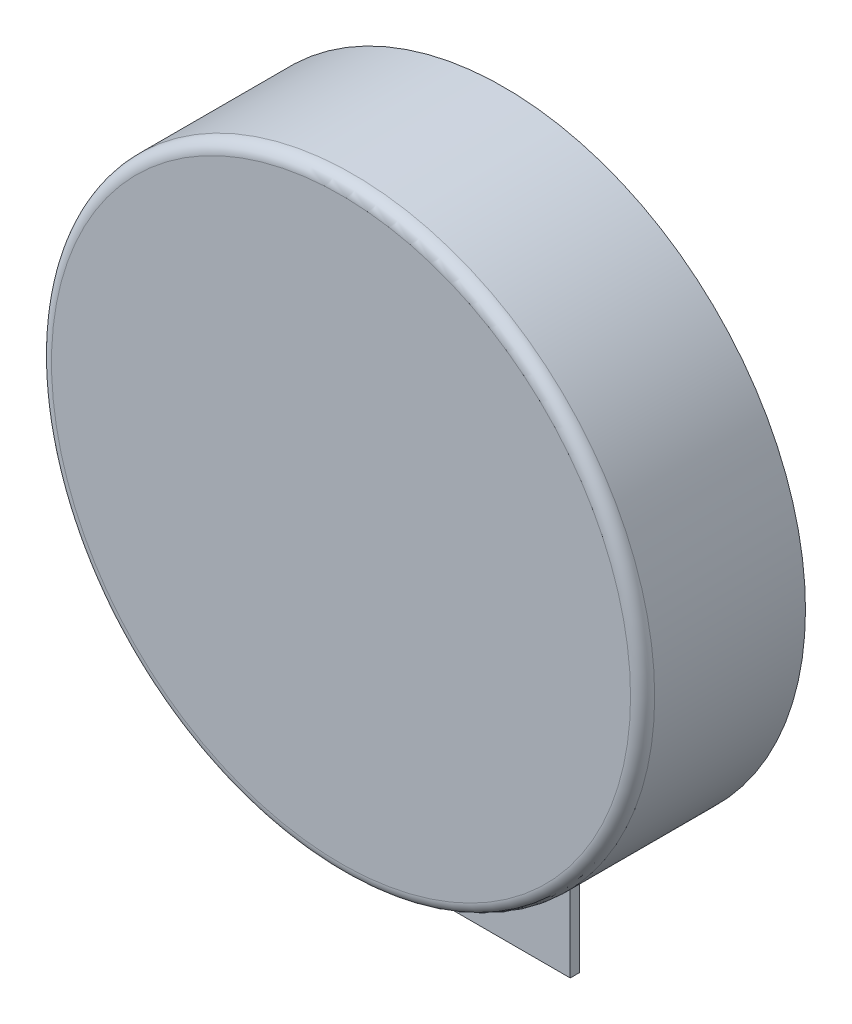
ISO-10303-21;
HEADER;
FILE_DESCRIPTION(('STEP AP214'),'2;1');
FILE_NAME('part.step','',(''),(''),'','','');
FILE_SCHEMA(('AUTOMOTIVE_DESIGN { 1 0 10303 214 1 1 1 1 }'));
ENDSEC;
DATA;
#1=APPLICATION_CONTEXT('core data for automotive mechanical design processes');
#2=APPLICATION_PROTOCOL_DEFINITION('international standard','automotive_design',2000,#1);
#3=PRODUCT_CONTEXT('',#1,'mechanical');
#4=PRODUCT('Part','Part','',(#3));
#5=PRODUCT_RELATED_PRODUCT_CATEGORY('part','',(#4));
#6=PRODUCT_DEFINITION_FORMATION('','',#4);
#7=PRODUCT_DEFINITION_CONTEXT('part definition',#1,'design');
#8=PRODUCT_DEFINITION('design','',#6,#7);
#9=PRODUCT_DEFINITION_SHAPE('','',#8);
#10=(LENGTH_UNIT() NAMED_UNIT(*) SI_UNIT(.MILLI.,.METRE.));
#11=(NAMED_UNIT(*) PLANE_ANGLE_UNIT() SI_UNIT($,.RADIAN.));
#12=(NAMED_UNIT(*) SI_UNIT($,.STERADIAN.) SOLID_ANGLE_UNIT());
#13=UNCERTAINTY_MEASURE_WITH_UNIT(LENGTH_MEASURE(1.E-05),#10,'distance_accuracy_value','');
#14=(GEOMETRIC_REPRESENTATION_CONTEXT(3) GLOBAL_UNCERTAINTY_ASSIGNED_CONTEXT((#13)) GLOBAL_UNIT_ASSIGNED_CONTEXT((#10,
#11,#12)) REPRESENTATION_CONTEXT('',''));
#15=CARTESIAN_POINT('',(0.,0.,0.));
#16=DIRECTION('',(0.,0.,1.));
#17=DIRECTION('',(1.,0.,0.));
#18=AXIS2_PLACEMENT_3D('',#15,#16,#17);
#19=CARTESIAN_POINT('',(0.,0.,2.7));
#20=DIRECTION('',(0.,0.,-1.));
#21=DIRECTION('',(-1.,0.,0.));
#22=AXIS2_PLACEMENT_3D('',#19,#20,#21);
#23=CYLINDRICAL_SURFACE('',#22,5.);
#24=CARTESIAN_POINT('',(0.,0.,2.5));
#25=DIRECTION('',(0.,0.,1.));
#26=DIRECTION('',(1.,0.,0.));
#27=AXIS2_PLACEMENT_3D('',#24,#25,#26);
#28=CIRCLE('',#27,5.);
#29=CARTESIAN_POINT('',(5.,0.,2.5));
#30=VERTEX_POINT('',#29);
#31=EDGE_CURVE('E11',#30,#30,#28,.F.);
#32=ORIENTED_EDGE('',*,*,#31,.T.);
#33=EDGE_LOOP('',(#32));
#34=FACE_BOUND('',#33,.T.);
#35=CARTESIAN_POINT('',(0.,0.,0.));
#36=DIRECTION('',(0.,0.,1.));
#37=DIRECTION('',(1.,0.,0.));
#38=AXIS2_PLACEMENT_3D('',#35,#36,#37);
#39=CIRCLE('',#38,5.);
#40=CARTESIAN_POINT('',(1.25,-4.84122918275927,0.));
#41=VERTEX_POINT('',#40);
#42=CARTESIAN_POINT('',(-1.25,-4.84122918275927,0.));
#43=VERTEX_POINT('',#42);
#44=EDGE_CURVE('E118',#41,#43,#39,.T.);
#45=ORIENTED_EDGE('',*,*,#44,.T.);
#46=DIRECTION('',(0.,0.,-1.));
#47=VECTOR('',#46,1.);
#48=CARTESIAN_POINT('',(-1.25,-4.84122918275927,2.7));
#49=LINE('',#48,#47);
#50=CARTESIAN_POINT('',(-1.25,-4.84122918275927,0.15));
#51=VERTEX_POINT('',#50);
#52=EDGE_CURVE('E63',#43,#51,#49,.F.);
#53=ORIENTED_EDGE('',*,*,#52,.T.);
#54=CARTESIAN_POINT('',(0.,0.,0.15));
#55=DIRECTION('',(0.,0.,1.));
#56=DIRECTION('',(1.,0.,0.));
#57=AXIS2_PLACEMENT_3D('',#54,#55,#56);
#58=CIRCLE('',#57,5.);
#59=CARTESIAN_POINT('',(1.25,-4.84122918275927,0.15));
#60=VERTEX_POINT('',#59);
#61=EDGE_CURVE('E58',#51,#60,#58,.T.);
#62=ORIENTED_EDGE('',*,*,#61,.T.);
#63=DIRECTION('',(0.,0.,-1.));
#64=VECTOR('',#63,1.);
#65=CARTESIAN_POINT('',(1.25,-4.84122918275927,2.7));
#66=LINE('',#65,#64);
#67=EDGE_CURVE('E89',#60,#41,#66,.T.);
#68=ORIENTED_EDGE('',*,*,#67,.T.);
#69=EDGE_LOOP('',(#45,#53,#62,#68));
#70=FACE_BOUND('',#69,.T.);
#71=ADVANCED_FACE('F43',(#34,#70),#23,.T.);
#72=CARTESIAN_POINT('',(0.,0.,2.7));
#73=DIRECTION('',(0.,0.,1.));
#74=DIRECTION('',(1.,0.,0.));
#75=AXIS2_PLACEMENT_3D('',#72,#73,#74);
#76=PLANE('',#75);
#77=CARTESIAN_POINT('',(0.,0.,2.7));
#78=DIRECTION('',(0.,0.,1.));
#79=DIRECTION('',(1.,0.,0.));
#80=AXIS2_PLACEMENT_3D('',#77,#78,#79);
#81=CIRCLE('',#80,4.8);
#82=CARTESIAN_POINT('',(4.8,0.,2.7));
#83=VERTEX_POINT('',#82);
#84=EDGE_CURVE('E51',#83,#83,#81,.T.);
#85=ORIENTED_EDGE('',*,*,#84,.T.);
#86=EDGE_LOOP('',(#85));
#87=FACE_BOUND('',#86,.T.);
#88=ADVANCED_FACE('F123',(#87),#76,.T.);
#89=CARTESIAN_POINT('',(0.,0.,0.));
#90=DIRECTION('',(0.,0.,1.));
#91=DIRECTION('',(1.,0.,0.));
#92=AXIS2_PLACEMENT_3D('',#89,#90,#91);
#93=PLANE('',#92);
#94=ORIENTED_EDGE('',*,*,#44,.F.);
#95=DIRECTION('',(0.,-1.,0.));
#96=VECTOR('',#95,1.);
#97=CARTESIAN_POINT('',(1.25,-4.84122918275927,0.));
#98=LINE('',#97,#96);
#99=CARTESIAN_POINT('',(1.25,-7.09122918275927,0.));
#100=VERTEX_POINT('',#99);
#101=EDGE_CURVE('E110',#41,#100,#98,.T.);
#102=ORIENTED_EDGE('',*,*,#101,.T.);
#103=DIRECTION('',(-1.,0.,0.));
#104=VECTOR('',#103,1.);
#105=CARTESIAN_POINT('',(-1.25,-7.09122918275927,0.));
#106=LINE('',#105,#104);
#107=CARTESIAN_POINT('',(-1.25,-7.09122918275927,0.));
#108=VERTEX_POINT('',#107);
#109=EDGE_CURVE('E100',#100,#108,#106,.T.);
#110=ORIENTED_EDGE('',*,*,#109,.T.);
#111=DIRECTION('',(0.,1.,0.));
#112=VECTOR('',#111,1.);
#113=CARTESIAN_POINT('',(-1.25,-4.84122918275927,0.));
#114=LINE('',#113,#112);
#115=EDGE_CURVE('E93',#108,#43,#114,.T.);
#116=ORIENTED_EDGE('',*,*,#115,.T.);
#117=EDGE_LOOP('',(#94,#102,#110,#116));
#118=FACE_BOUND('',#117,.T.);
#119=ADVANCED_FACE('F137',(#118),#93,.F.);
#120=CARTESIAN_POINT('',(0.,0.,0.15));
#121=DIRECTION('',(0.,0.,1.));
#122=DIRECTION('',(1.,0.,0.));
#123=AXIS2_PLACEMENT_3D('',#120,#121,#122);
#124=PLANE('',#123);
#125=ORIENTED_EDGE('',*,*,#61,.F.);
#126=DIRECTION('',(0.,1.,0.));
#127=VECTOR('',#126,1.);
#128=CARTESIAN_POINT('',(-1.25,-4.84122918275927,0.15));
#129=LINE('',#128,#127);
#130=CARTESIAN_POINT('',(-1.25,-7.09122918275927,0.15));
#131=VERTEX_POINT('',#130);
#132=EDGE_CURVE('E102',#131,#51,#129,.T.);
#133=ORIENTED_EDGE('',*,*,#132,.F.);
#134=DIRECTION('',(-1.,0.,0.));
#135=VECTOR('',#134,1.);
#136=CARTESIAN_POINT('',(-1.25,-7.09122918275927,0.15));
#137=LINE('',#136,#135);
#138=CARTESIAN_POINT('',(1.25,-7.09122918275927,0.15));
#139=VERTEX_POINT('',#138);
#140=EDGE_CURVE('E92',#139,#131,#137,.T.);
#141=ORIENTED_EDGE('',*,*,#140,.F.);
#142=DIRECTION('',(0.,-1.,0.));
#143=VECTOR('',#142,1.);
#144=CARTESIAN_POINT('',(1.25,-4.17973326244027,0.15));
#145=LINE('',#144,#143);
#146=EDGE_CURVE('E83',#60,#139,#145,.T.);
#147=ORIENTED_EDGE('',*,*,#146,.F.);
#148=EDGE_LOOP('',(#125,#133,#141,#147));
#149=FACE_BOUND('',#148,.T.);
#150=ADVANCED_FACE('F105',(#149),#124,.T.);
#151=CARTESIAN_POINT('',(-1.25,-4.84122918275927,0.15));
#152=DIRECTION('',(-1.,0.,0.));
#153=DIRECTION('',(0.,0.,1.));
#154=AXIS2_PLACEMENT_3D('',#151,#152,#153);
#155=PLANE('',#154);
#156=ORIENTED_EDGE('',*,*,#52,.F.);
#157=ORIENTED_EDGE('',*,*,#115,.F.);
#158=DIRECTION('',(0.,0.,-1.));
#159=VECTOR('',#158,1.);
#160=CARTESIAN_POINT('',(-1.25,-7.09122918275927,0.15));
#161=LINE('',#160,#159);
#162=EDGE_CURVE('E101',#131,#108,#161,.T.);
#163=ORIENTED_EDGE('',*,*,#162,.F.);
#164=ORIENTED_EDGE('',*,*,#132,.T.);
#165=EDGE_LOOP('',(#156,#157,#163,#164));
#166=FACE_BOUND('',#165,.T.);
#167=ADVANCED_FACE('F144',(#166),#155,.T.);
#168=CARTESIAN_POINT('',(1.25,-4.84122918275927,0.15));
#169=DIRECTION('',(1.,0.,0.));
#170=DIRECTION('',(0.,1.,0.));
#171=AXIS2_PLACEMENT_3D('',#168,#169,#170);
#172=PLANE('',#171);
#173=ORIENTED_EDGE('',*,*,#67,.F.);
#174=ORIENTED_EDGE('',*,*,#146,.T.);
#175=DIRECTION('',(0.,0.,-1.));
#176=VECTOR('',#175,1.);
#177=CARTESIAN_POINT('',(1.25,-7.09122918275927,0.15));
#178=LINE('',#177,#176);
#179=EDGE_CURVE('E87',#139,#100,#178,.T.);
#180=ORIENTED_EDGE('',*,*,#179,.T.);
#181=ORIENTED_EDGE('',*,*,#101,.F.);
#182=EDGE_LOOP('',(#173,#174,#180,#181));
#183=FACE_BOUND('',#182,.T.);
#184=ADVANCED_FACE('F85',(#183),#172,.T.);
#185=CARTESIAN_POINT('',(-1.25,-7.09122918275927,0.15));
#186=DIRECTION('',(0.,-1.,0.));
#187=DIRECTION('',(0.,0.,-1.));
#188=AXIS2_PLACEMENT_3D('',#185,#186,#187);
#189=PLANE('',#188);
#190=ORIENTED_EDGE('',*,*,#109,.F.);
#191=ORIENTED_EDGE('',*,*,#179,.F.);
#192=ORIENTED_EDGE('',*,*,#140,.T.);
#193=ORIENTED_EDGE('',*,*,#162,.T.);
#194=EDGE_LOOP('',(#190,#191,#192,#193));
#195=FACE_BOUND('',#194,.T.);
#196=ADVANCED_FACE('F97',(#195),#189,.T.);
#197=CARTESIAN_POINT('',(0.,0.,2.5));
#198=DIRECTION('',(0.,0.,1.));
#199=DIRECTION('',(1.,0.,0.));
#200=AXIS2_PLACEMENT_3D('',#197,#198,#199);
#201=TOROIDAL_SURFACE('',#200,4.8,0.2);
#202=ORIENTED_EDGE('',*,*,#31,.F.);
#203=EDGE_LOOP('',(#202));
#204=FACE_BOUND('',#203,.T.);
#205=ORIENTED_EDGE('',*,*,#84,.F.);
#206=EDGE_LOOP('',(#205));
#207=FACE_BOUND('',#206,.T.);
#208=ADVANCED_FACE('F45',(#204,#207),#201,.T.);
#209=CLOSED_SHELL('',(#71,#88,#119,#150,#167,#184,#196,#208));
#210=MANIFOLD_SOLID_BREP('B2',#209);
#211=ADVANCED_BREP_SHAPE_REPRESENTATION('',(#18,#210),#14);
#212=SHAPE_DEFINITION_REPRESENTATION(#9,#211);
ENDSEC;
END-ISO-10303-21;
